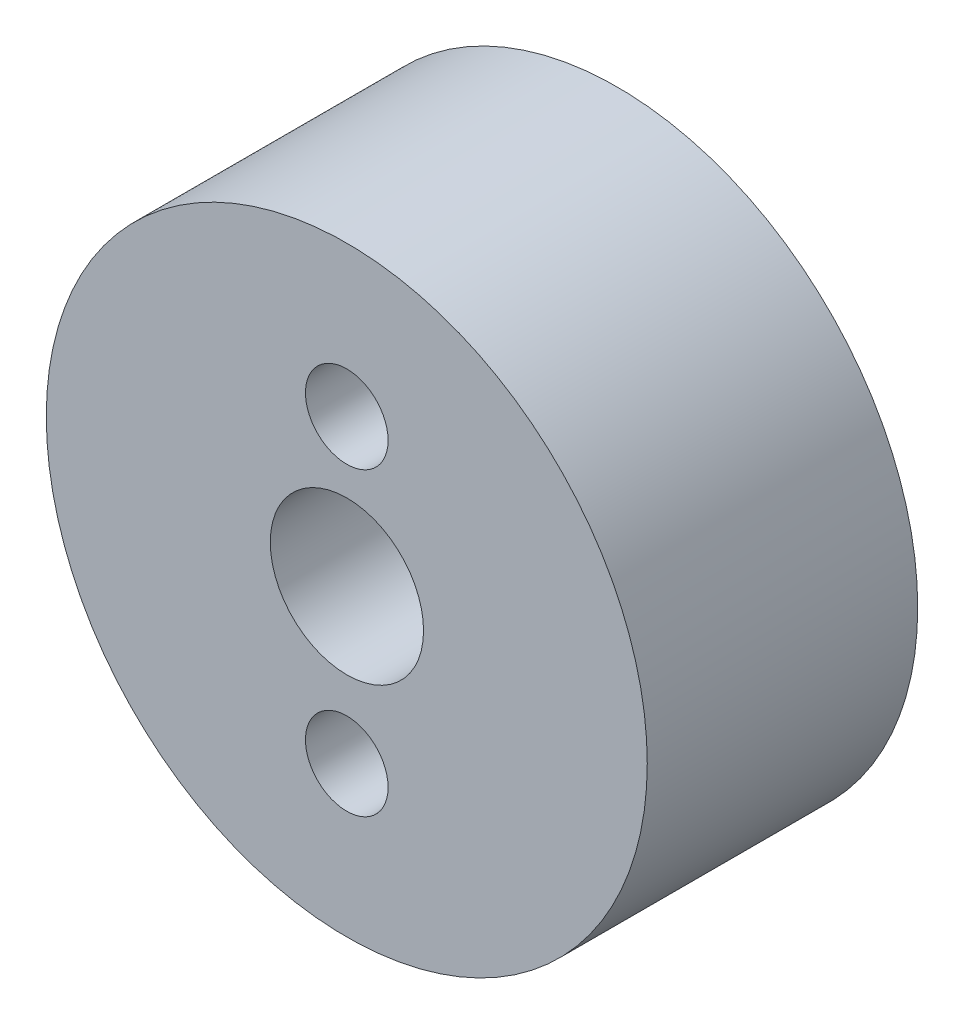
ISO-10303-21;
HEADER;
FILE_DESCRIPTION(('STEP AP214'),'2;1');
FILE_NAME('part.step','',(''),(''),'','','');
FILE_SCHEMA(('AUTOMOTIVE_DESIGN { 1 0 10303 214 1 1 1 1 }'));
ENDSEC;
DATA;
#1=APPLICATION_CONTEXT('core data for automotive mechanical design processes');
#2=APPLICATION_PROTOCOL_DEFINITION('international standard','automotive_design',2000,#1);
#3=PRODUCT_CONTEXT('',#1,'mechanical');
#4=PRODUCT('Part','Part','',(#3));
#5=PRODUCT_RELATED_PRODUCT_CATEGORY('part','',(#4));
#6=PRODUCT_DEFINITION_FORMATION('','',#4);
#7=PRODUCT_DEFINITION_CONTEXT('part definition',#1,'design');
#8=PRODUCT_DEFINITION('design','',#6,#7);
#9=PRODUCT_DEFINITION_SHAPE('','',#8);
#10=(LENGTH_UNIT() NAMED_UNIT(*) SI_UNIT(.MILLI.,.METRE.));
#11=(NAMED_UNIT(*) PLANE_ANGLE_UNIT() SI_UNIT($,.RADIAN.));
#12=(NAMED_UNIT(*) SI_UNIT($,.STERADIAN.) SOLID_ANGLE_UNIT());
#13=UNCERTAINTY_MEASURE_WITH_UNIT(LENGTH_MEASURE(1.E-05),#10,'distance_accuracy_value','');
#14=(GEOMETRIC_REPRESENTATION_CONTEXT(3) GLOBAL_UNCERTAINTY_ASSIGNED_CONTEXT((#13)) GLOBAL_UNIT_ASSIGNED_CONTEXT((#10,
#11,#12)) REPRESENTATION_CONTEXT('',''));
#15=CARTESIAN_POINT('',(0.,0.,0.));
#16=DIRECTION('',(0.,0.,1.));
#17=DIRECTION('',(1.,0.,0.));
#18=AXIS2_PLACEMENT_3D('',#15,#16,#17);
#19=CARTESIAN_POINT('',(7.3114484627872E-06,4.64266431529568E-06,45.0639905349175));
#20=DIRECTION('',(0.,0.,-1.));
#21=DIRECTION('',(-1.,0.,0.));
#22=AXIS2_PLACEMENT_3D('',#19,#20,#21);
#23=CYLINDRICAL_SURFACE('',#22,20.);
#24=CARTESIAN_POINT('',(7.3114484627872E-06,4.64266431529568E-06,16.7033116098821));
#25=DIRECTION('',(0.,0.,1.));
#26=DIRECTION('',(1.,0.,0.));
#27=AXIS2_PLACEMENT_3D('',#24,#25,#26);
#28=CIRCLE('',#27,20.);
#29=CARTESIAN_POINT('',(20.0000073114485,4.64266431529568E-06,16.7033116098821));
#30=VERTEX_POINT('',#29);
#31=EDGE_CURVE('E150',#30,#30,#28,.T.);
#32=ORIENTED_EDGE('',*,*,#31,.T.);
#33=EDGE_LOOP('',(#32));
#34=FACE_BOUND('',#33,.T.);
#35=CARTESIAN_POINT('',(7.3114484627872E-06,4.64266431529568E-06,34.7033116098821));
#36=DIRECTION('',(0.,0.,-1.));
#37=DIRECTION('',(-1.,0.,0.));
#38=AXIS2_PLACEMENT_3D('',#35,#36,#37);
#39=CIRCLE('',#38,20.);
#40=CARTESIAN_POINT('',(-19.9999926885515,4.64266431529568E-06,34.7033116098821));
#41=VERTEX_POINT('',#40);
#42=EDGE_CURVE('E138',#41,#41,#39,.T.);
#43=ORIENTED_EDGE('',*,*,#42,.T.);
#44=EDGE_LOOP('',(#43));
#45=FACE_BOUND('',#44,.T.);
#46=ADVANCED_FACE('F126',(#34,#45),#23,.T.);
#47=CARTESIAN_POINT('',(0.00935962319433556,0.215183115524063,12.7075266081097));
#48=DIRECTION('',(0.,0.,1.));
#49=DIRECTION('',(1.,0.,0.));
#50=AXIS2_PLACEMENT_3D('',#47,#48,#49);
#51=CYLINDRICAL_SURFACE('',#50,5.1);
#52=CARTESIAN_POINT('',(0.00935962319433556,0.215183115524063,16.7033116098821));
#53=DIRECTION('',(0.,0.,1.));
#54=DIRECTION('',(1.,0.,0.));
#55=AXIS2_PLACEMENT_3D('',#52,#53,#54);
#56=CIRCLE('',#55,5.1);
#57=CARTESIAN_POINT('',(5.10935962319434,0.215183115524063,16.7033116098821));
#58=VERTEX_POINT('',#57);
#59=EDGE_CURVE('E146',#58,#58,#56,.F.);
#60=ORIENTED_EDGE('',*,*,#59,.T.);
#61=EDGE_LOOP('',(#60));
#62=FACE_BOUND('',#61,.T.);
#63=CARTESIAN_POINT('',(0.00935962319433556,0.215183115524063,34.7033116098821));
#64=DIRECTION('',(0.,0.,-1.));
#65=DIRECTION('',(-1.,0.,0.));
#66=AXIS2_PLACEMENT_3D('',#63,#64,#65);
#67=CIRCLE('',#66,5.1);
#68=CARTESIAN_POINT('',(-5.09064037680567,0.215183115524063,34.7033116098821));
#69=VERTEX_POINT('',#68);
#70=EDGE_CURVE('E143',#69,#69,#67,.F.);
#71=ORIENTED_EDGE('',*,*,#70,.T.);
#72=EDGE_LOOP('',(#71));
#73=FACE_BOUND('',#72,.T.);
#74=ADVANCED_FACE('F197',(#62,#73),#51,.F.);
#75=CARTESIAN_POINT('',(0.,0.,34.7033116098821));
#76=DIRECTION('',(0.,0.,-1.));
#77=DIRECTION('',(-1.,0.,0.));
#78=AXIS2_PLACEMENT_3D('',#75,#76,#77);
#79=PLANE('',#78);
#80=CARTESIAN_POINT('',(0.,10.,34.7033116098821));
#81=DIRECTION('',(0.,0.,1.));
#82=DIRECTION('',(1.,0.,0.));
#83=AXIS2_PLACEMENT_3D('',#80,#81,#82);
#84=CIRCLE('',#83,2.75);
#85=CARTESIAN_POINT('',(2.75,10.,34.7033116098821));
#86=VERTEX_POINT('',#85);
#87=EDGE_CURVE('E167',#86,#86,#84,.T.);
#88=ORIENTED_EDGE('',*,*,#87,.F.);
#89=EDGE_LOOP('',(#88));
#90=FACE_BOUND('',#89,.T.);
#91=CARTESIAN_POINT('',(0.,-10.,34.7033116098821));
#92=DIRECTION('',(0.,0.,1.));
#93=DIRECTION('',(1.,0.,0.));
#94=AXIS2_PLACEMENT_3D('',#91,#92,#93);
#95=CIRCLE('',#94,2.75);
#96=CARTESIAN_POINT('',(2.75,-10.,34.7033116098821));
#97=VERTEX_POINT('',#96);
#98=EDGE_CURVE('E158',#97,#97,#95,.T.);
#99=ORIENTED_EDGE('',*,*,#98,.F.);
#100=EDGE_LOOP('',(#99));
#101=FACE_BOUND('',#100,.T.);
#102=ORIENTED_EDGE('',*,*,#70,.F.);
#103=EDGE_LOOP('',(#102));
#104=FACE_BOUND('',#103,.T.);
#105=ORIENTED_EDGE('',*,*,#42,.F.);
#106=EDGE_LOOP('',(#105));
#107=FACE_BOUND('',#106,.T.);
#108=ADVANCED_FACE('F202',(#90,#101,#104,#107),#79,.F.);
#109=CARTESIAN_POINT('',(0.00935962319433556,0.215183115524063,16.7033116098821));
#110=DIRECTION('',(0.,0.,1.));
#111=DIRECTION('',(1.,0.,0.));
#112=AXIS2_PLACEMENT_3D('',#109,#110,#111);
#113=PLANE('',#112);
#114=CARTESIAN_POINT('',(0.,-10.,16.7033116098821));
#115=DIRECTION('',(0.,0.,1.));
#116=DIRECTION('',(1.,0.,0.));
#117=AXIS2_PLACEMENT_3D('',#114,#115,#116);
#118=CIRCLE('',#117,2.5);
#119=CARTESIAN_POINT('',(2.5,-10.,16.7033116098821));
#120=VERTEX_POINT('',#119);
#121=EDGE_CURVE('E11',#120,#120,#118,.F.);
#122=ORIENTED_EDGE('',*,*,#121,.F.);
#123=EDGE_LOOP('',(#122));
#124=FACE_BOUND('',#123,.T.);
#125=CARTESIAN_POINT('',(0.,10.,16.7033116098821));
#126=DIRECTION('',(0.,0.,1.));
#127=DIRECTION('',(1.,0.,0.));
#128=AXIS2_PLACEMENT_3D('',#125,#126,#127);
#129=CIRCLE('',#128,2.5);
#130=CARTESIAN_POINT('',(2.5,10.,16.7033116098821));
#131=VERTEX_POINT('',#130);
#132=EDGE_CURVE('E133',#131,#131,#129,.F.);
#133=ORIENTED_EDGE('',*,*,#132,.F.);
#134=EDGE_LOOP('',(#133));
#135=FACE_BOUND('',#134,.T.);
#136=ORIENTED_EDGE('',*,*,#59,.F.);
#137=EDGE_LOOP('',(#136));
#138=FACE_BOUND('',#137,.T.);
#139=ORIENTED_EDGE('',*,*,#31,.F.);
#140=EDGE_LOOP('',(#139));
#141=FACE_BOUND('',#140,.T.);
#142=ADVANCED_FACE('F209',(#124,#135,#138,#141),#113,.F.);
#143=CARTESIAN_POINT('',(0.,-10.,18.7033116098821));
#144=DIRECTION('',(0.,0.,1.));
#145=DIRECTION('',(1.,0.,0.));
#146=AXIS2_PLACEMENT_3D('',#143,#144,#145);
#147=CYLINDRICAL_SURFACE('',#146,2.75);
#148=CARTESIAN_POINT('',(0.,-10.,18.7033116098821));
#149=DIRECTION('',(0.,0.,1.));
#150=DIRECTION('',(1.,0.,0.));
#151=AXIS2_PLACEMENT_3D('',#148,#149,#150);
#152=CIRCLE('',#151,2.75);
#153=CARTESIAN_POINT('',(2.75,-10.,18.7033116098821));
#154=VERTEX_POINT('',#153);
#155=EDGE_CURVE('E162',#154,#154,#152,.T.);
#156=ORIENTED_EDGE('',*,*,#155,.F.);
#157=EDGE_LOOP('',(#156));
#158=FACE_BOUND('',#157,.T.);
#159=ORIENTED_EDGE('',*,*,#98,.T.);
#160=EDGE_LOOP('',(#159));
#161=FACE_BOUND('',#160,.T.);
#162=ADVANCED_FACE('F215',(#158,#161),#147,.F.);
#163=CARTESIAN_POINT('',(0.,-10.,18.7033116098821));
#164=DIRECTION('',(0.,0.,1.));
#165=DIRECTION('',(1.,0.,0.));
#166=AXIS2_PLACEMENT_3D('',#163,#164,#165);
#167=PLANE('',#166);
#168=ORIENTED_EDGE('',*,*,#155,.T.);
#169=EDGE_LOOP('',(#168));
#170=FACE_BOUND('',#169,.T.);
#171=ADVANCED_FACE('F223',(#170),#167,.T.);
#172=CARTESIAN_POINT('',(0.,10.,18.7033116098821));
#173=DIRECTION('',(0.,0.,1.));
#174=DIRECTION('',(1.,0.,0.));
#175=AXIS2_PLACEMENT_3D('',#172,#173,#174);
#176=CYLINDRICAL_SURFACE('',#175,2.75);
#177=CARTESIAN_POINT('',(0.,10.,18.7033116098821));
#178=DIRECTION('',(0.,0.,1.));
#179=DIRECTION('',(1.,0.,0.));
#180=AXIS2_PLACEMENT_3D('',#177,#178,#179);
#181=CIRCLE('',#180,2.75);
#182=CARTESIAN_POINT('',(2.75,10.,18.7033116098821));
#183=VERTEX_POINT('',#182);
#184=EDGE_CURVE('E151',#183,#183,#181,.T.);
#185=ORIENTED_EDGE('',*,*,#184,.F.);
#186=EDGE_LOOP('',(#185));
#187=FACE_BOUND('',#186,.T.);
#188=ORIENTED_EDGE('',*,*,#87,.T.);
#189=EDGE_LOOP('',(#188));
#190=FACE_BOUND('',#189,.T.);
#191=ADVANCED_FACE('F227',(#187,#190),#176,.F.);
#192=CARTESIAN_POINT('',(0.,10.,18.7033116098821));
#193=DIRECTION('',(0.,0.,1.));
#194=DIRECTION('',(1.,0.,0.));
#195=AXIS2_PLACEMENT_3D('',#192,#193,#194);
#196=PLANE('',#195);
#197=ORIENTED_EDGE('',*,*,#184,.T.);
#198=EDGE_LOOP('',(#197));
#199=FACE_BOUND('',#198,.T.);
#200=ADVANCED_FACE('F231',(#199),#196,.T.);
#201=CARTESIAN_POINT('',(0.,10.,11.7033116098821));
#202=DIRECTION('',(0.,0.,1.));
#203=DIRECTION('',(1.,0.,0.));
#204=AXIS2_PLACEMENT_3D('',#201,#202,#203);
#205=CYLINDRICAL_SURFACE('',#204,2.5);
#206=CARTESIAN_POINT('',(0.,10.,11.7033116098821));
#207=DIRECTION('',(0.,0.,-1.));
#208=DIRECTION('',(-1.,0.,0.));
#209=AXIS2_PLACEMENT_3D('',#206,#207,#208);
#210=CIRCLE('',#209,2.5);
#211=CARTESIAN_POINT('',(-2.5,10.,11.7033116098821));
#212=VERTEX_POINT('',#211);
#213=EDGE_CURVE('E163',#212,#212,#210,.T.);
#214=ORIENTED_EDGE('',*,*,#213,.F.);
#215=EDGE_LOOP('',(#214));
#216=FACE_BOUND('',#215,.T.);
#217=ORIENTED_EDGE('',*,*,#132,.T.);
#218=EDGE_LOOP('',(#217));
#219=FACE_BOUND('',#218,.T.);
#220=ADVANCED_FACE('F193',(#216,#219),#205,.T.);
#221=CARTESIAN_POINT('',(0.,10.,11.7033116098821));
#222=DIRECTION('',(0.,0.,-1.));
#223=DIRECTION('',(-1.,0.,0.));
#224=AXIS2_PLACEMENT_3D('',#221,#222,#223);
#225=PLANE('',#224);
#226=ORIENTED_EDGE('',*,*,#213,.T.);
#227=EDGE_LOOP('',(#226));
#228=FACE_BOUND('',#227,.T.);
#229=ADVANCED_FACE('F186',(#228),#225,.T.);
#230=CARTESIAN_POINT('',(0.,-10.,11.7033116098821));
#231=DIRECTION('',(0.,0.,1.));
#232=DIRECTION('',(1.,0.,0.));
#233=AXIS2_PLACEMENT_3D('',#230,#231,#232);
#234=CYLINDRICAL_SURFACE('',#233,2.5);
#235=CARTESIAN_POINT('',(0.,-10.,11.7033116098821));
#236=DIRECTION('',(0.,0.,-1.));
#237=DIRECTION('',(-1.,0.,0.));
#238=AXIS2_PLACEMENT_3D('',#235,#236,#237);
#239=CIRCLE('',#238,2.5);
#240=CARTESIAN_POINT('',(-2.5,-10.,11.7033116098821));
#241=VERTEX_POINT('',#240);
#242=EDGE_CURVE('E177',#241,#241,#239,.T.);
#243=ORIENTED_EDGE('',*,*,#242,.F.);
#244=EDGE_LOOP('',(#243));
#245=FACE_BOUND('',#244,.T.);
#246=ORIENTED_EDGE('',*,*,#121,.T.);
#247=EDGE_LOOP('',(#246));
#248=FACE_BOUND('',#247,.T.);
#249=ADVANCED_FACE('F184',(#245,#248),#234,.T.);
#250=CARTESIAN_POINT('',(0.,-10.,11.7033116098821));
#251=DIRECTION('',(0.,0.,-1.));
#252=DIRECTION('',(-1.,0.,0.));
#253=AXIS2_PLACEMENT_3D('',#250,#251,#252);
#254=PLANE('',#253);
#255=ORIENTED_EDGE('',*,*,#242,.T.);
#256=EDGE_LOOP('',(#255));
#257=FACE_BOUND('',#256,.T.);
#258=ADVANCED_FACE('F182',(#257),#254,.T.);
#259=CLOSED_SHELL('',(#46,#74,#108,#142,#162,#171,#191,#200,#220,#229,#249,#258));
#260=MANIFOLD_SOLID_BREP('B2',#259);
#261=ADVANCED_BREP_SHAPE_REPRESENTATION('',(#18,#260),#14);
#262=SHAPE_DEFINITION_REPRESENTATION(#9,#261);
ENDSEC;
END-ISO-10303-21;
